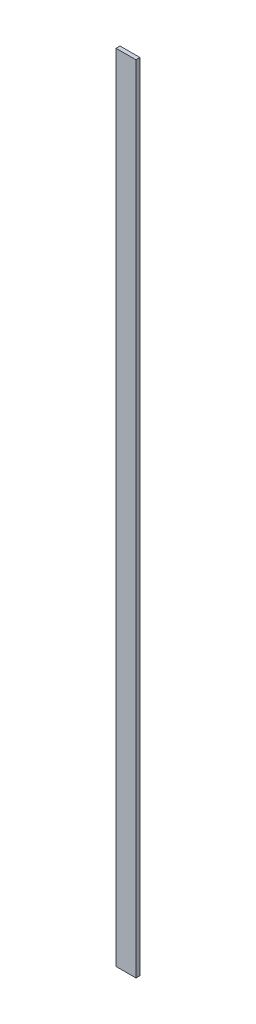
ISO-10303-21;
HEADER;
FILE_DESCRIPTION(('STEP AP214'),'2;1');
FILE_NAME('part.step','',(''),(''),'','','');
FILE_SCHEMA(('AUTOMOTIVE_DESIGN { 1 0 10303 214 1 1 1 1 }'));
ENDSEC;
DATA;
#1=APPLICATION_CONTEXT('core data for automotive mechanical design processes');
#2=APPLICATION_PROTOCOL_DEFINITION('international standard','automotive_design',2000,#1);
#3=PRODUCT_CONTEXT('',#1,'mechanical');
#4=PRODUCT('Part','Part','',(#3));
#5=PRODUCT_RELATED_PRODUCT_CATEGORY('part','',(#4));
#6=PRODUCT_DEFINITION_FORMATION('','',#4);
#7=PRODUCT_DEFINITION_CONTEXT('part definition',#1,'design');
#8=PRODUCT_DEFINITION('design','',#6,#7);
#9=PRODUCT_DEFINITION_SHAPE('','',#8);
#10=(LENGTH_UNIT() NAMED_UNIT(*) SI_UNIT(.MILLI.,.METRE.));
#11=(NAMED_UNIT(*) PLANE_ANGLE_UNIT() SI_UNIT($,.RADIAN.));
#12=(NAMED_UNIT(*) SI_UNIT($,.STERADIAN.) SOLID_ANGLE_UNIT());
#13=UNCERTAINTY_MEASURE_WITH_UNIT(LENGTH_MEASURE(1.E-05),#10,'distance_accuracy_value','');
#14=(GEOMETRIC_REPRESENTATION_CONTEXT(3) GLOBAL_UNCERTAINTY_ASSIGNED_CONTEXT((#13)) GLOBAL_UNIT_ASSIGNED_CONTEXT((#10,
#11,#12)) REPRESENTATION_CONTEXT('',''));
#15=CARTESIAN_POINT('',(0.,0.,0.));
#16=DIRECTION('',(0.,0.,1.));
#17=DIRECTION('',(1.,0.,0.));
#18=AXIS2_PLACEMENT_3D('',#15,#16,#17);
#19=CARTESIAN_POINT('',(-12.5,-500.000000000004,2.5));
#20=DIRECTION('',(1.,0.,0.));
#21=DIRECTION('',(0.,0.,-1.00000000000001));
#22=AXIS2_PLACEMENT_3D('',#19,#20,#21);
#23=PLANE('',#22);
#24=DIRECTION('',(0.,-1.00000000000001,0.));
#25=VECTOR('',#24,1.);
#26=CARTESIAN_POINT('',(-12.5,-500.000000000004,-2.49999999999991));
#27=LINE('',#26,#25);
#28=CARTESIAN_POINT('',(-12.5,500.000000000002,-2.50000000000039));
#29=VERTEX_POINT('',#28);
#30=CARTESIAN_POINT('',(-12.5,-500.000000000004,-2.49999999999991));
#31=VERTEX_POINT('',#30);
#32=EDGE_CURVE('E95',#29,#31,#27,.T.);
#33=ORIENTED_EDGE('',*,*,#32,.T.);
#34=DIRECTION('',(0.,0.,-1.00000000000001));
#35=VECTOR('',#34,1.);
#36=CARTESIAN_POINT('',(-12.5,-500.000000000004,2.5));
#37=LINE('',#36,#35);
#38=CARTESIAN_POINT('',(-12.5,-500.000000000004,2.5));
#39=VERTEX_POINT('',#38);
#40=EDGE_CURVE('E11',#39,#31,#37,.T.);
#41=ORIENTED_EDGE('',*,*,#40,.F.);
#42=DIRECTION('',(0.,-1.00000000000001,0.));
#43=VECTOR('',#42,1.);
#44=CARTESIAN_POINT('',(-12.5,-500.000000000004,2.5));
#45=LINE('',#44,#43);
#46=CARTESIAN_POINT('',(-12.5,500.000000000002,2.50000000000011));
#47=VERTEX_POINT('',#46);
#48=EDGE_CURVE('E83',#47,#39,#45,.T.);
#49=ORIENTED_EDGE('',*,*,#48,.F.);
#50=DIRECTION('',(0.,0.,-1.00000000000001));
#51=VECTOR('',#50,1.);
#52=CARTESIAN_POINT('',(-12.5,500.000000000002,2.50000000000011));
#53=LINE('',#52,#51);
#54=EDGE_CURVE('E91',#47,#29,#53,.T.);
#55=ORIENTED_EDGE('',*,*,#54,.T.);
#56=EDGE_LOOP('',(#33,#41,#49,#55));
#57=FACE_BOUND('',#56,.T.);
#58=ADVANCED_FACE('F32',(#57),#23,.F.);
#59=CARTESIAN_POINT('',(12.5,-500.000000000004,2.5));
#60=DIRECTION('',(0.,1.00000000000001,0.));
#61=DIRECTION('',(0.,0.,1.00000000000001));
#62=AXIS2_PLACEMENT_3D('',#59,#60,#61);
#63=PLANE('',#62);
#64=DIRECTION('',(1.,0.,0.));
#65=VECTOR('',#64,1.);
#66=CARTESIAN_POINT('',(12.5,-500.000000000004,-2.49999999999991));
#67=LINE('',#66,#65);
#68=CARTESIAN_POINT('',(12.5,-500.000000000004,-2.49999999999991));
#69=VERTEX_POINT('',#68);
#70=EDGE_CURVE('E87',#31,#69,#67,.T.);
#71=ORIENTED_EDGE('',*,*,#70,.T.);
#72=DIRECTION('',(0.,0.,-1.00000000000001));
#73=VECTOR('',#72,1.);
#74=CARTESIAN_POINT('',(12.5,-500.000000000004,2.5));
#75=LINE('',#74,#73);
#76=CARTESIAN_POINT('',(12.5,-500.000000000004,2.5));
#77=VERTEX_POINT('',#76);
#78=EDGE_CURVE('E40',#77,#69,#75,.T.);
#79=ORIENTED_EDGE('',*,*,#78,.F.);
#80=DIRECTION('',(1.,0.,0.));
#81=VECTOR('',#80,1.);
#82=CARTESIAN_POINT('',(12.5,-500.000000000004,2.5));
#83=LINE('',#82,#81);
#84=EDGE_CURVE('E78',#39,#77,#83,.T.);
#85=ORIENTED_EDGE('',*,*,#84,.F.);
#86=ORIENTED_EDGE('',*,*,#40,.T.);
#87=EDGE_LOOP('',(#71,#79,#85,#86));
#88=FACE_BOUND('',#87,.T.);
#89=ADVANCED_FACE('F86',(#88),#63,.F.);
#90=CARTESIAN_POINT('',(12.5,-500.000000000004,2.5));
#91=DIRECTION('',(-1.,0.,0.));
#92=DIRECTION('',(0.,0.,1.00000000000001));
#93=AXIS2_PLACEMENT_3D('',#90,#91,#92);
#94=PLANE('',#93);
#95=DIRECTION('',(0.,1.00000000000001,0.));
#96=VECTOR('',#95,1.);
#97=CARTESIAN_POINT('',(12.5,-500.000000000004,-2.49999999999991));
#98=LINE('',#97,#96);
#99=CARTESIAN_POINT('',(12.5,500.000000000002,-2.50000000000039));
#100=VERTEX_POINT('',#99);
#101=EDGE_CURVE('E65',#69,#100,#98,.T.);
#102=ORIENTED_EDGE('',*,*,#101,.T.);
#103=DIRECTION('',(0.,0.,-1.00000000000001));
#104=VECTOR('',#103,1.);
#105=CARTESIAN_POINT('',(12.5,500.000000000002,2.50000000000011));
#106=LINE('',#105,#104);
#107=CARTESIAN_POINT('',(12.5,500.000000000002,2.50000000000011));
#108=VERTEX_POINT('',#107);
#109=EDGE_CURVE('E88',#108,#100,#106,.T.);
#110=ORIENTED_EDGE('',*,*,#109,.F.);
#111=DIRECTION('',(0.,1.00000000000001,0.));
#112=VECTOR('',#111,1.);
#113=CARTESIAN_POINT('',(12.5,-500.000000000004,2.5));
#114=LINE('',#113,#112);
#115=EDGE_CURVE('E81',#77,#108,#114,.T.);
#116=ORIENTED_EDGE('',*,*,#115,.F.);
#117=ORIENTED_EDGE('',*,*,#78,.T.);
#118=EDGE_LOOP('',(#102,#110,#116,#117));
#119=FACE_BOUND('',#118,.T.);
#120=ADVANCED_FACE('F89',(#119),#94,.F.);
#121=CARTESIAN_POINT('',(12.5,500.000000000002,2.50000000000011));
#122=DIRECTION('',(0.,-1.00000000000001,0.));
#123=DIRECTION('',(0.,0.,-1.00000000000001));
#124=AXIS2_PLACEMENT_3D('',#121,#122,#123);
#125=PLANE('',#124);
#126=DIRECTION('',(-1.,0.,0.));
#127=VECTOR('',#126,1.);
#128=CARTESIAN_POINT('',(12.5,500.000000000002,-2.50000000000039));
#129=LINE('',#128,#127);
#130=EDGE_CURVE('E71',#100,#29,#129,.T.);
#131=ORIENTED_EDGE('',*,*,#130,.T.);
#132=ORIENTED_EDGE('',*,*,#54,.F.);
#133=DIRECTION('',(-1.,0.,0.));
#134=VECTOR('',#133,1.);
#135=CARTESIAN_POINT('',(12.5,500.000000000002,2.50000000000011));
#136=LINE('',#135,#134);
#137=EDGE_CURVE('E48',#108,#47,#136,.T.);
#138=ORIENTED_EDGE('',*,*,#137,.F.);
#139=ORIENTED_EDGE('',*,*,#109,.T.);
#140=EDGE_LOOP('',(#131,#132,#138,#139));
#141=FACE_BOUND('',#140,.T.);
#142=ADVANCED_FACE('F102',(#141),#125,.F.);
#143=CARTESIAN_POINT('',(0.,3.33066907387547E-13,2.49999999999997));
#144=DIRECTION('',(0.,0.,1.00000000000001));
#145=DIRECTION('',(1.,0.,0.));
#146=AXIS2_PLACEMENT_3D('',#143,#144,#145);
#147=PLANE('',#146);
#148=ORIENTED_EDGE('',*,*,#48,.T.);
#149=ORIENTED_EDGE('',*,*,#84,.T.);
#150=ORIENTED_EDGE('',*,*,#115,.T.);
#151=ORIENTED_EDGE('',*,*,#137,.T.);
#152=EDGE_LOOP('',(#148,#149,#150,#151));
#153=FACE_BOUND('',#152,.T.);
#154=ADVANCED_FACE('F79',(#153),#147,.T.);
#155=CARTESIAN_POINT('',(0.,1.11022302462516E-13,-2.50000000000003));
#156=DIRECTION('',(0.,0.,1.00000000000001));
#157=DIRECTION('',(1.,0.,0.));
#158=AXIS2_PLACEMENT_3D('',#155,#156,#157);
#159=PLANE('',#158);
#160=ORIENTED_EDGE('',*,*,#32,.F.);
#161=ORIENTED_EDGE('',*,*,#130,.F.);
#162=ORIENTED_EDGE('',*,*,#101,.F.);
#163=ORIENTED_EDGE('',*,*,#70,.F.);
#164=EDGE_LOOP('',(#160,#161,#162,#163));
#165=FACE_BOUND('',#164,.T.);
#166=ADVANCED_FACE('F105',(#165),#159,.F.);
#167=CLOSED_SHELL('',(#58,#89,#120,#142,#154,#166));
#168=MANIFOLD_SOLID_BREP('B2',#167);
#169=ADVANCED_BREP_SHAPE_REPRESENTATION('',(#18,#168),#14);
#170=SHAPE_DEFINITION_REPRESENTATION(#9,#169);
ENDSEC;
END-ISO-10303-21;
